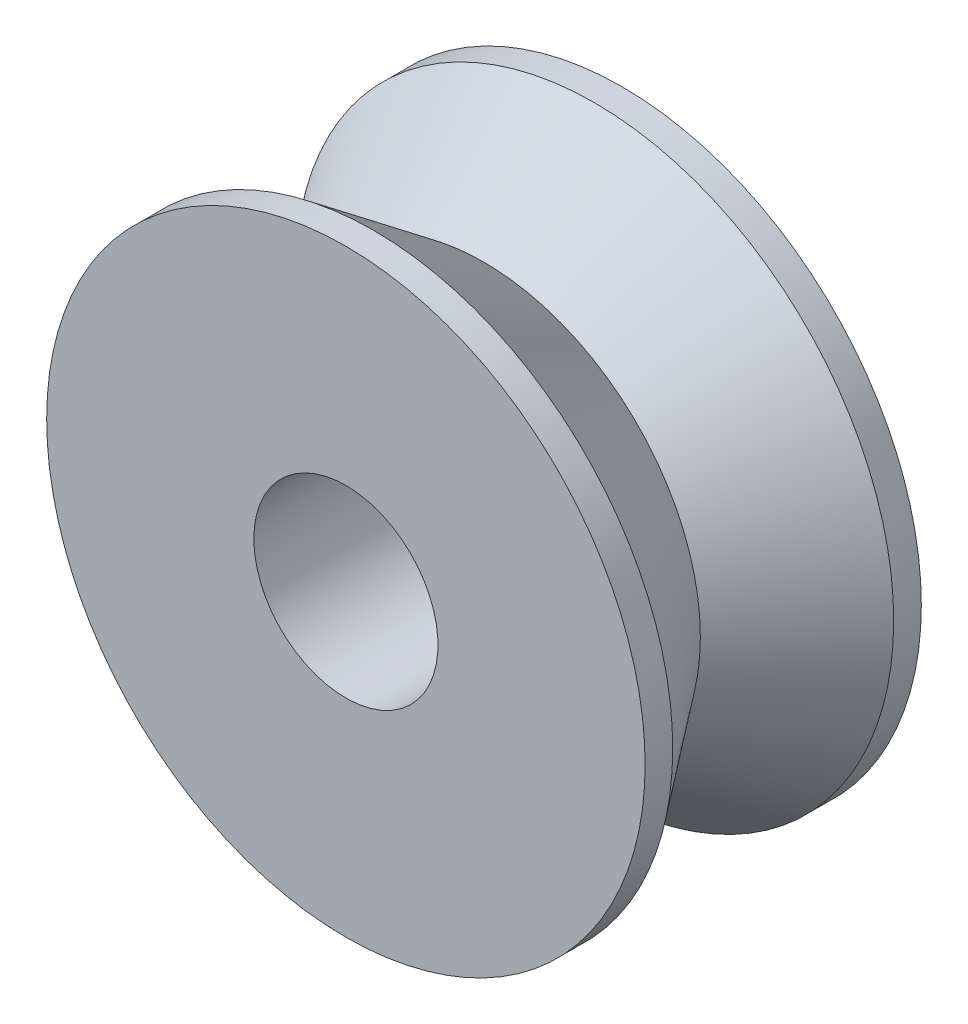
ISO-10303-21;
HEADER;
FILE_DESCRIPTION(('STEP AP214'),'2;1');
FILE_NAME('part.step','',(''),(''),'','','');
FILE_SCHEMA(('AUTOMOTIVE_DESIGN { 1 0 10303 214 1 1 1 1 }'));
ENDSEC;
DATA;
#1=APPLICATION_CONTEXT('core data for automotive mechanical design processes');
#2=APPLICATION_PROTOCOL_DEFINITION('international standard','automotive_design',2000,#1);
#3=PRODUCT_CONTEXT('',#1,'mechanical');
#4=PRODUCT('Part','Part','',(#3));
#5=PRODUCT_RELATED_PRODUCT_CATEGORY('part','',(#4));
#6=PRODUCT_DEFINITION_FORMATION('','',#4);
#7=PRODUCT_DEFINITION_CONTEXT('part definition',#1,'design');
#8=PRODUCT_DEFINITION('design','',#6,#7);
#9=PRODUCT_DEFINITION_SHAPE('','',#8);
#10=(LENGTH_UNIT() NAMED_UNIT(*) SI_UNIT(.MILLI.,.METRE.));
#11=(NAMED_UNIT(*) PLANE_ANGLE_UNIT() SI_UNIT($,.RADIAN.));
#12=(NAMED_UNIT(*) SI_UNIT($,.STERADIAN.) SOLID_ANGLE_UNIT());
#13=UNCERTAINTY_MEASURE_WITH_UNIT(LENGTH_MEASURE(1.E-05),#10,'distance_accuracy_value','');
#14=(GEOMETRIC_REPRESENTATION_CONTEXT(3) GLOBAL_UNCERTAINTY_ASSIGNED_CONTEXT((#13)) GLOBAL_UNIT_ASSIGNED_CONTEXT((#10,
#11,#12)) REPRESENTATION_CONTEXT('',''));
#15=CARTESIAN_POINT('',(0.,0.,0.));
#16=DIRECTION('',(0.,0.,1.));
#17=DIRECTION('',(1.,0.,0.));
#18=AXIS2_PLACEMENT_3D('',#15,#16,#17);
#19=CARTESIAN_POINT('',(0.,2.,-3.));
#20=DIRECTION('',(0.,0.,-1.));
#21=DIRECTION('',(-1.,0.,0.));
#22=AXIS2_PLACEMENT_3D('',#19,#20,#21);
#23=PLANE('',#22);
#24=CARTESIAN_POINT('',(0.,0.,-3.));
#25=DIRECTION('',(0.,0.,-1.));
#26=DIRECTION('',(-1.,0.,0.));
#27=AXIS2_PLACEMENT_3D('',#24,#25,#26);
#28=CIRCLE('',#27,6.5);
#29=CARTESIAN_POINT('',(-6.5,0.,-3.));
#30=VERTEX_POINT('',#29);
#31=EDGE_CURVE('E10',#30,#30,#28,.T.);
#32=ORIENTED_EDGE('',*,*,#31,.T.);
#33=EDGE_LOOP('',(#32));
#34=FACE_BOUND('',#33,.T.);
#35=CARTESIAN_POINT('',(0.,0.,-3.));
#36=DIRECTION('',(0.,0.,-1.));
#37=DIRECTION('',(-1.,0.,0.));
#38=AXIS2_PLACEMENT_3D('',#35,#36,#37);
#39=CIRCLE('',#38,2.);
#40=CARTESIAN_POINT('',(-2.,0.,-3.));
#41=VERTEX_POINT('',#40);
#42=EDGE_CURVE('E59',#41,#41,#39,.T.);
#43=ORIENTED_EDGE('',*,*,#42,.F.);
#44=EDGE_LOOP('',(#43));
#45=FACE_BOUND('',#44,.T.);
#46=ADVANCED_FACE('F34',(#34,#45),#23,.T.);
#47=CARTESIAN_POINT('',(0.,0.,0.));
#48=DIRECTION('',(0.,0.,-1.));
#49=DIRECTION('',(-1.,0.,0.));
#50=AXIS2_PLACEMENT_3D('',#47,#48,#49);
#51=CYLINDRICAL_SURFACE('',#50,6.5);
#52=CARTESIAN_POINT('',(0.,0.,-2.4));
#53=DIRECTION('',(0.,0.,-1.));
#54=DIRECTION('',(-1.,0.,0.));
#55=AXIS2_PLACEMENT_3D('',#52,#53,#54);
#56=CIRCLE('',#55,6.5);
#57=CARTESIAN_POINT('',(-6.5,0.,-2.4));
#58=VERTEX_POINT('',#57);
#59=EDGE_CURVE('E40',#58,#58,#56,.T.);
#60=ORIENTED_EDGE('',*,*,#59,.T.);
#61=EDGE_LOOP('',(#60));
#62=FACE_BOUND('',#61,.T.);
#63=ORIENTED_EDGE('',*,*,#31,.F.);
#64=EDGE_LOOP('',(#63));
#65=FACE_BOUND('',#64,.T.);
#66=ADVANCED_FACE('F67',(#62,#65),#51,.T.);
#67=CARTESIAN_POINT('',(0.,0.,-2.4));
#68=DIRECTION('',(0.,0.,-1.));
#69=DIRECTION('',(-1.,0.,0.));
#70=AXIS2_PLACEMENT_3D('',#67,#68,#69);
#71=CONICAL_SURFACE('',#70,6.5,0.643501108793284);
#72=CARTESIAN_POINT('',(0.,0.,0.));
#73=DIRECTION('',(0.,0.,-1.));
#74=DIRECTION('',(-1.,0.,0.));
#75=AXIS2_PLACEMENT_3D('',#72,#73,#74);
#76=CIRCLE('',#75,4.7);
#77=CARTESIAN_POINT('',(-4.7,0.,0.));
#78=VERTEX_POINT('',#77);
#79=EDGE_CURVE('E44',#78,#78,#76,.T.);
#80=ORIENTED_EDGE('',*,*,#79,.T.);
#81=EDGE_LOOP('',(#80));
#82=FACE_BOUND('',#81,.T.);
#83=ORIENTED_EDGE('',*,*,#59,.F.);
#84=EDGE_LOOP('',(#83));
#85=FACE_BOUND('',#84,.T.);
#86=ADVANCED_FACE('F71',(#82,#85),#71,.T.);
#87=CARTESIAN_POINT('',(0.,0.,0.));
#88=DIRECTION('',(0.,0.,1.));
#89=DIRECTION('',(1.,0.,0.));
#90=AXIS2_PLACEMENT_3D('',#87,#88,#89);
#91=CONICAL_SURFACE('',#90,4.7,0.643501108793284);
#92=CARTESIAN_POINT('',(0.,0.,2.4));
#93=DIRECTION('',(0.,0.,-1.));
#94=DIRECTION('',(-1.,0.,0.));
#95=AXIS2_PLACEMENT_3D('',#92,#93,#94);
#96=CIRCLE('',#95,6.5);
#97=CARTESIAN_POINT('',(-6.5,0.,2.4));
#98=VERTEX_POINT('',#97);
#99=EDGE_CURVE('E48',#98,#98,#96,.T.);
#100=ORIENTED_EDGE('',*,*,#99,.T.);
#101=EDGE_LOOP('',(#100));
#102=FACE_BOUND('',#101,.T.);
#103=ORIENTED_EDGE('',*,*,#79,.F.);
#104=EDGE_LOOP('',(#103));
#105=FACE_BOUND('',#104,.T.);
#106=ADVANCED_FACE('F75',(#102,#105),#91,.T.);
#107=CARTESIAN_POINT('',(0.,0.,0.));
#108=DIRECTION('',(0.,0.,-1.));
#109=DIRECTION('',(-1.,0.,0.));
#110=AXIS2_PLACEMENT_3D('',#107,#108,#109);
#111=CYLINDRICAL_SURFACE('',#110,6.5);
#112=CARTESIAN_POINT('',(0.,0.,3.));
#113=DIRECTION('',(0.,0.,-1.));
#114=DIRECTION('',(-1.,0.,0.));
#115=AXIS2_PLACEMENT_3D('',#112,#113,#114);
#116=CIRCLE('',#115,6.5);
#117=CARTESIAN_POINT('',(-6.5,0.,3.));
#118=VERTEX_POINT('',#117);
#119=EDGE_CURVE('E53',#118,#118,#116,.T.);
#120=ORIENTED_EDGE('',*,*,#119,.T.);
#121=EDGE_LOOP('',(#120));
#122=FACE_BOUND('',#121,.T.);
#123=ORIENTED_EDGE('',*,*,#99,.F.);
#124=EDGE_LOOP('',(#123));
#125=FACE_BOUND('',#124,.T.);
#126=ADVANCED_FACE('F82',(#122,#125),#111,.T.);
#127=CARTESIAN_POINT('',(0.,2.,3.));
#128=DIRECTION('',(0.,0.,1.));
#129=DIRECTION('',(1.,0.,0.));
#130=AXIS2_PLACEMENT_3D('',#127,#128,#129);
#131=PLANE('',#130);
#132=CARTESIAN_POINT('',(0.,0.,3.));
#133=DIRECTION('',(0.,0.,-1.));
#134=DIRECTION('',(-1.,0.,0.));
#135=AXIS2_PLACEMENT_3D('',#132,#133,#134);
#136=CIRCLE('',#135,2.);
#137=CARTESIAN_POINT('',(-2.,0.,3.));
#138=VERTEX_POINT('',#137);
#139=EDGE_CURVE('E56',#138,#138,#136,.T.);
#140=ORIENTED_EDGE('',*,*,#139,.T.);
#141=EDGE_LOOP('',(#140));
#142=FACE_BOUND('',#141,.T.);
#143=ORIENTED_EDGE('',*,*,#119,.F.);
#144=EDGE_LOOP('',(#143));
#145=FACE_BOUND('',#144,.T.);
#146=ADVANCED_FACE('F86',(#142,#145),#131,.T.);
#147=CARTESIAN_POINT('',(0.,0.,0.));
#148=DIRECTION('',(0.,0.,-1.));
#149=DIRECTION('',(-1.,0.,0.));
#150=AXIS2_PLACEMENT_3D('',#147,#148,#149);
#151=CYLINDRICAL_SURFACE('',#150,2.);
#152=ORIENTED_EDGE('',*,*,#42,.T.);
#153=EDGE_LOOP('',(#152));
#154=FACE_BOUND('',#153,.T.);
#155=ORIENTED_EDGE('',*,*,#139,.F.);
#156=EDGE_LOOP('',(#155));
#157=FACE_BOUND('',#156,.T.);
#158=ADVANCED_FACE('F63',(#154,#157),#151,.F.);
#159=CLOSED_SHELL('',(#46,#66,#86,#106,#126,#146,#158));
#160=MANIFOLD_SOLID_BREP('B2',#159);
#161=ADVANCED_BREP_SHAPE_REPRESENTATION('',(#18,#160),#14);
#162=SHAPE_DEFINITION_REPRESENTATION(#9,#161);
ENDSEC;
END-ISO-10303-21;
